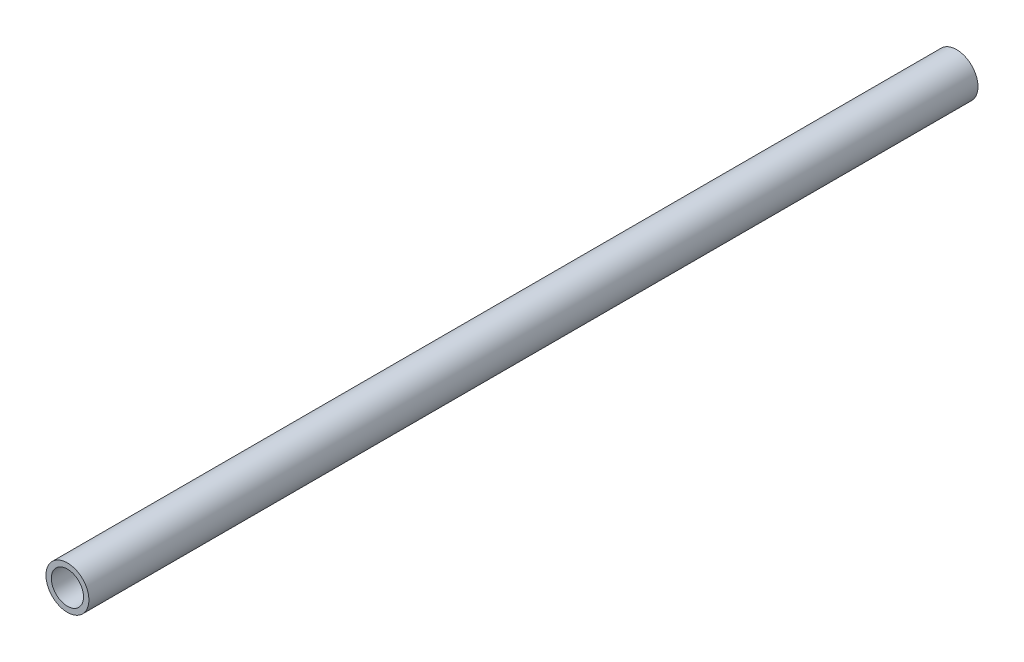
ISO-10303-21;
HEADER;
FILE_DESCRIPTION(('STEP AP214'),'2;1');
FILE_NAME('part.step','',(''),(''),'','','');
FILE_SCHEMA(('AUTOMOTIVE_DESIGN { 1 0 10303 214 1 1 1 1 }'));
ENDSEC;
DATA;
#1=APPLICATION_CONTEXT('core data for automotive mechanical design processes');
#2=APPLICATION_PROTOCOL_DEFINITION('international standard','automotive_design',2000,#1);
#3=PRODUCT_CONTEXT('',#1,'mechanical');
#4=PRODUCT('Part','Part','',(#3));
#5=PRODUCT_RELATED_PRODUCT_CATEGORY('part','',(#4));
#6=PRODUCT_DEFINITION_FORMATION('','',#4);
#7=PRODUCT_DEFINITION_CONTEXT('part definition',#1,'design');
#8=PRODUCT_DEFINITION('design','',#6,#7);
#9=PRODUCT_DEFINITION_SHAPE('','',#8);
#10=(LENGTH_UNIT() NAMED_UNIT(*) SI_UNIT(.MILLI.,.METRE.));
#11=(NAMED_UNIT(*) PLANE_ANGLE_UNIT() SI_UNIT($,.RADIAN.));
#12=(NAMED_UNIT(*) SI_UNIT($,.STERADIAN.) SOLID_ANGLE_UNIT());
#13=UNCERTAINTY_MEASURE_WITH_UNIT(LENGTH_MEASURE(1.E-05),#10,'distance_accuracy_value','');
#14=(GEOMETRIC_REPRESENTATION_CONTEXT(3) GLOBAL_UNCERTAINTY_ASSIGNED_CONTEXT((#13)) GLOBAL_UNIT_ASSIGNED_CONTEXT((#10,
#11,#12)) REPRESENTATION_CONTEXT('',''));
#15=CARTESIAN_POINT('',(0.,0.,0.));
#16=DIRECTION('',(0.,0.,1.));
#17=DIRECTION('',(1.,0.,0.));
#18=AXIS2_PLACEMENT_3D('',#15,#16,#17);
#19=CARTESIAN_POINT('',(0.,0.,263.06907));
#20=DIRECTION('',(0.,0.,1.));
#21=DIRECTION('',(1.,0.,0.));
#22=AXIS2_PLACEMENT_3D('',#19,#20,#21);
#23=PLANE('',#22);
#24=CARTESIAN_POINT('',(0.,0.,263.06907));
#25=DIRECTION('',(0.,0.,1.));
#26=DIRECTION('',(1.,0.,0.));
#27=AXIS2_PLACEMENT_3D('',#24,#25,#26);
#28=CIRCLE('',#27,12.7);
#29=CARTESIAN_POINT('',(12.7,0.,263.06907));
#30=VERTEX_POINT('',#29);
#31=EDGE_CURVE('E10',#30,#30,#28,.T.);
#32=ORIENTED_EDGE('',*,*,#31,.T.);
#33=EDGE_LOOP('',(#32));
#34=FACE_BOUND('',#33,.T.);
#35=CARTESIAN_POINT('',(0.,0.,263.06907));
#36=DIRECTION('',(0.,0.,1.));
#37=DIRECTION('',(1.,0.,0.));
#38=AXIS2_PLACEMENT_3D('',#35,#36,#37);
#39=CIRCLE('',#38,9.525);
#40=CARTESIAN_POINT('',(9.525,0.,263.06907));
#41=VERTEX_POINT('',#40);
#42=EDGE_CURVE('E54',#41,#41,#39,.T.);
#43=ORIENTED_EDGE('',*,*,#42,.F.);
#44=EDGE_LOOP('',(#43));
#45=FACE_BOUND('',#44,.T.);
#46=ADVANCED_FACE('F41',(#34,#45),#23,.T.);
#47=CARTESIAN_POINT('',(0.,0.,-263.06907));
#48=DIRECTION('',(0.,0.,1.));
#49=DIRECTION('',(1.,0.,0.));
#50=AXIS2_PLACEMENT_3D('',#47,#48,#49);
#51=PLANE('',#50);
#52=CARTESIAN_POINT('',(0.,0.,-263.06907));
#53=DIRECTION('',(0.,0.,1.));
#54=DIRECTION('',(1.,0.,0.));
#55=AXIS2_PLACEMENT_3D('',#52,#53,#54);
#56=CIRCLE('',#55,12.7);
#57=CARTESIAN_POINT('',(12.7,0.,-263.06907));
#58=VERTEX_POINT('',#57);
#59=EDGE_CURVE('E45',#58,#58,#56,.T.);
#60=ORIENTED_EDGE('',*,*,#59,.F.);
#61=EDGE_LOOP('',(#60));
#62=FACE_BOUND('',#61,.T.);
#63=CARTESIAN_POINT('',(0.,0.,-263.06907));
#64=DIRECTION('',(0.,0.,1.));
#65=DIRECTION('',(1.,0.,0.));
#66=AXIS2_PLACEMENT_3D('',#63,#64,#65);
#67=CIRCLE('',#66,9.525);
#68=CARTESIAN_POINT('',(9.525,0.,-263.06907));
#69=VERTEX_POINT('',#68);
#70=EDGE_CURVE('E56',#69,#69,#67,.T.);
#71=ORIENTED_EDGE('',*,*,#70,.T.);
#72=EDGE_LOOP('',(#71));
#73=FACE_BOUND('',#72,.T.);
#74=ADVANCED_FACE('F68',(#62,#73),#51,.F.);
#75=CARTESIAN_POINT('',(0.,0.,263.06907));
#76=DIRECTION('',(0.,0.,-1.));
#77=DIRECTION('',(-1.,0.,0.));
#78=AXIS2_PLACEMENT_3D('',#75,#76,#77);
#79=CYLINDRICAL_SURFACE('',#78,12.7);
#80=ORIENTED_EDGE('',*,*,#31,.F.);
#81=EDGE_LOOP('',(#80));
#82=FACE_BOUND('',#81,.T.);
#83=ORIENTED_EDGE('',*,*,#59,.T.);
#84=EDGE_LOOP('',(#83));
#85=FACE_BOUND('',#84,.T.);
#86=ADVANCED_FACE('F43',(#82,#85),#79,.T.);
#87=CARTESIAN_POINT('',(0.,0.,263.06907));
#88=DIRECTION('',(0.,0.,-1.));
#89=DIRECTION('',(-1.,0.,0.));
#90=AXIS2_PLACEMENT_3D('',#87,#88,#89);
#91=CYLINDRICAL_SURFACE('',#90,9.525);
#92=ORIENTED_EDGE('',*,*,#42,.T.);
#93=EDGE_LOOP('',(#92));
#94=FACE_BOUND('',#93,.T.);
#95=ORIENTED_EDGE('',*,*,#70,.F.);
#96=EDGE_LOOP('',(#95));
#97=FACE_BOUND('',#96,.T.);
#98=ADVANCED_FACE('F64',(#94,#97),#91,.F.);
#99=CLOSED_SHELL('',(#46,#74,#86,#98));
#100=MANIFOLD_SOLID_BREP('B2',#99);
#101=ADVANCED_BREP_SHAPE_REPRESENTATION('',(#18,#100),#14);
#102=SHAPE_DEFINITION_REPRESENTATION(#9,#101);
ENDSEC;
END-ISO-10303-21;
